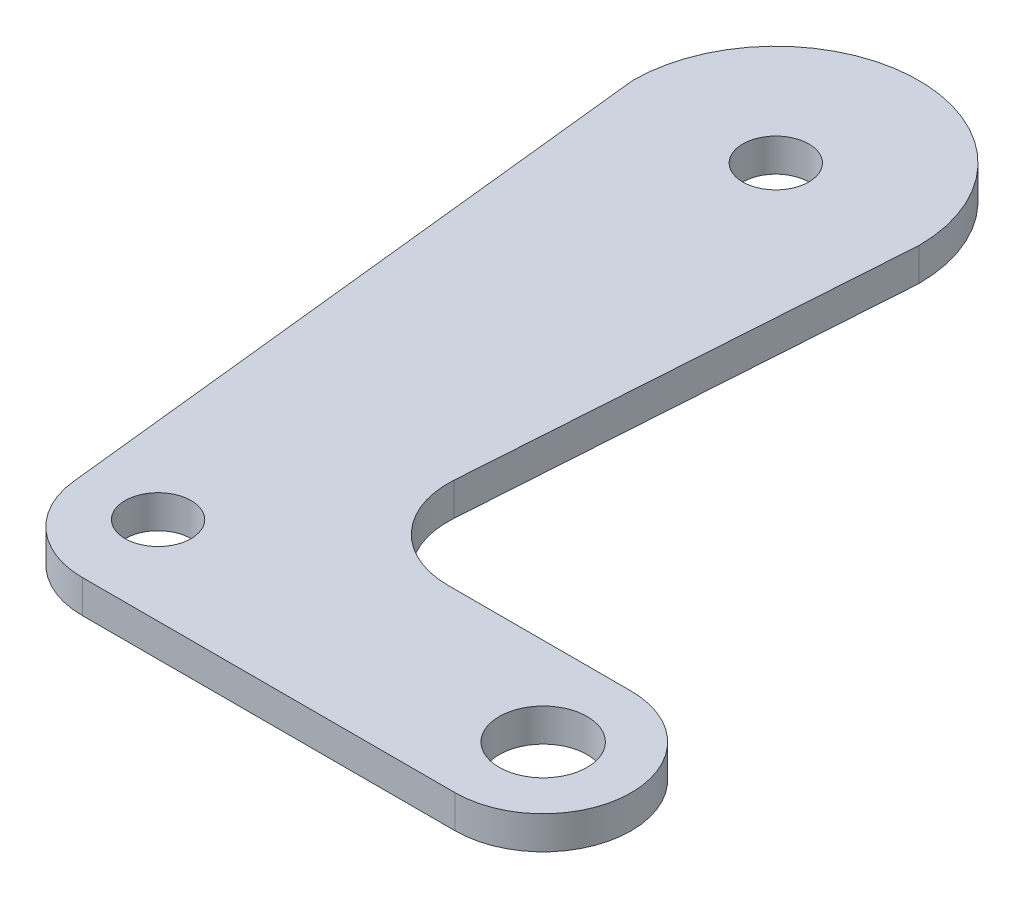
ISO-10303-21;
HEADER;
FILE_DESCRIPTION(('STEP AP214'),'2;1');
FILE_NAME('part.step','',(''),(''),'','','');
FILE_SCHEMA(('AUTOMOTIVE_DESIGN { 1 0 10303 214 1 1 1 1 }'));
ENDSEC;
DATA;
#1=APPLICATION_CONTEXT('core data for automotive mechanical design processes');
#2=APPLICATION_PROTOCOL_DEFINITION('international standard','automotive_design',2000,#1);
#3=PRODUCT_CONTEXT('',#1,'mechanical');
#4=PRODUCT('Part','Part','',(#3));
#5=PRODUCT_RELATED_PRODUCT_CATEGORY('part','',(#4));
#6=PRODUCT_DEFINITION_FORMATION('','',#4);
#7=PRODUCT_DEFINITION_CONTEXT('part definition',#1,'design');
#8=PRODUCT_DEFINITION('design','',#6,#7);
#9=PRODUCT_DEFINITION_SHAPE('','',#8);
#10=(LENGTH_UNIT() NAMED_UNIT(*) SI_UNIT(.MILLI.,.METRE.));
#11=(NAMED_UNIT(*) PLANE_ANGLE_UNIT() SI_UNIT($,.RADIAN.));
#12=(NAMED_UNIT(*) SI_UNIT($,.STERADIAN.) SOLID_ANGLE_UNIT());
#13=UNCERTAINTY_MEASURE_WITH_UNIT(LENGTH_MEASURE(1.E-05),#10,'distance_accuracy_value','');
#14=(GEOMETRIC_REPRESENTATION_CONTEXT(3) GLOBAL_UNCERTAINTY_ASSIGNED_CONTEXT((#13)) GLOBAL_UNIT_ASSIGNED_CONTEXT((#10,
#11,#12)) REPRESENTATION_CONTEXT('',''));
#15=CARTESIAN_POINT('',(0.,0.,0.));
#16=DIRECTION('',(0.,0.,1.));
#17=DIRECTION('',(1.,0.,0.));
#18=AXIS2_PLACEMENT_3D('',#15,#16,#17);
#19=CARTESIAN_POINT('',(35.,-3.,0.));
#20=DIRECTION('',(0.,1.,0.));
#21=DIRECTION('',(0.,0.,1.));
#22=AXIS2_PLACEMENT_3D('',#19,#20,#21);
#23=CYLINDRICAL_SURFACE('',#22,8.);
#24=CARTESIAN_POINT('',(35.,0.,0.));
#25=DIRECTION('',(0.,1.,0.));
#26=DIRECTION('',(0.,0.,1.));
#27=AXIS2_PLACEMENT_3D('',#24,#25,#26);
#28=CIRCLE('',#27,8.);
#29=CARTESIAN_POINT('',(35.,0.,8.));
#30=VERTEX_POINT('',#29);
#31=CARTESIAN_POINT('',(35.,0.,-8.));
#32=VERTEX_POINT('',#31);
#33=EDGE_CURVE('E136',#30,#32,#28,.T.);
#34=ORIENTED_EDGE('',*,*,#33,.F.);
#35=DIRECTION('',(0.,1.,0.));
#36=VECTOR('',#35,1.);
#37=CARTESIAN_POINT('',(35.,-3.,8.));
#38=LINE('',#37,#36);
#39=CARTESIAN_POINT('',(35.,-3.,8.));
#40=VERTEX_POINT('',#39);
#41=EDGE_CURVE('E11',#40,#30,#38,.T.);
#42=ORIENTED_EDGE('',*,*,#41,.F.);
#43=CARTESIAN_POINT('',(35.,-3.,0.));
#44=DIRECTION('',(0.,1.,0.));
#45=DIRECTION('',(0.,0.,1.));
#46=AXIS2_PLACEMENT_3D('',#43,#44,#45);
#47=CIRCLE('',#46,8.);
#48=CARTESIAN_POINT('',(35.,-3.,-8.));
#49=VERTEX_POINT('',#48);
#50=EDGE_CURVE('E157',#40,#49,#47,.T.);
#51=ORIENTED_EDGE('',*,*,#50,.T.);
#52=DIRECTION('',(0.,1.,0.));
#53=VECTOR('',#52,1.);
#54=CARTESIAN_POINT('',(35.,-3.,-8.));
#55=LINE('',#54,#53);
#56=EDGE_CURVE('E42',#49,#32,#55,.T.);
#57=ORIENTED_EDGE('',*,*,#56,.T.);
#58=EDGE_LOOP('',(#34,#42,#51,#57));
#59=FACE_BOUND('',#58,.T.);
#60=ADVANCED_FACE('F39',(#59),#23,.T.);
#61=CARTESIAN_POINT('',(35.,-3.,8.));
#62=DIRECTION('',(0.,0.,1.));
#63=DIRECTION('',(1.,0.,0.));
#64=AXIS2_PLACEMENT_3D('',#61,#62,#63);
#65=PLANE('',#64);
#66=DIRECTION('',(1.,0.,0.));
#67=VECTOR('',#66,1.);
#68=CARTESIAN_POINT('',(35.,0.,8.));
#69=LINE('',#68,#67);
#70=CARTESIAN_POINT('',(1.10862917569041,0.,8.));
#71=VERTEX_POINT('',#70);
#72=EDGE_CURVE('E155',#71,#30,#69,.T.);
#73=ORIENTED_EDGE('',*,*,#72,.F.);
#74=DIRECTION('',(0.,1.,0.));
#75=VECTOR('',#74,1.);
#76=CARTESIAN_POINT('',(1.10862917569041,-3.,8.));
#77=LINE('',#76,#75);
#78=CARTESIAN_POINT('',(1.10862917569041,-3.,8.));
#79=VERTEX_POINT('',#78);
#80=EDGE_CURVE('E48',#79,#71,#77,.T.);
#81=ORIENTED_EDGE('',*,*,#80,.F.);
#82=DIRECTION('',(1.,0.,0.));
#83=VECTOR('',#82,1.);
#84=CARTESIAN_POINT('',(35.,-3.,8.));
#85=LINE('',#84,#83);
#86=EDGE_CURVE('E126',#79,#40,#85,.T.);
#87=ORIENTED_EDGE('',*,*,#86,.T.);
#88=ORIENTED_EDGE('',*,*,#41,.T.);
#89=EDGE_LOOP('',(#73,#81,#87,#88));
#90=FACE_BOUND('',#89,.T.);
#91=ADVANCED_FACE('F169',(#90),#65,.T.);
#92=CARTESIAN_POINT('',(1.10862917569041,-3.,0.));
#93=DIRECTION('',(0.,1.,0.));
#94=DIRECTION('',(0.,0.,1.));
#95=AXIS2_PLACEMENT_3D('',#92,#93,#94);
#96=CYLINDRICAL_SURFACE('',#95,8.);
#97=CARTESIAN_POINT('',(1.10862917569041,0.,0.));
#98=DIRECTION('',(0.,1.,0.));
#99=DIRECTION('',(0.,0.,-1.));
#100=AXIS2_PLACEMENT_3D('',#97,#98,#99);
#101=CIRCLE('',#100,8.);
#102=CARTESIAN_POINT('',(-6.84513596427269,0.,0.858848122957551));
#103=VERTEX_POINT('',#102);
#104=EDGE_CURVE('E113',#103,#71,#101,.T.);
#105=ORIENTED_EDGE('',*,*,#104,.F.);
#106=DIRECTION('',(0.,1.,0.));
#107=VECTOR('',#106,1.);
#108=CARTESIAN_POINT('',(-6.84513596427269,-3.,0.858848122957551));
#109=LINE('',#108,#107);
#110=CARTESIAN_POINT('',(-6.84513596427269,-3.,0.858848122957551));
#111=VERTEX_POINT('',#110);
#112=EDGE_CURVE('E108',#111,#103,#109,.T.);
#113=ORIENTED_EDGE('',*,*,#112,.F.);
#114=CARTESIAN_POINT('',(1.10862917569041,-3.,0.));
#115=DIRECTION('',(0.,1.,0.));
#116=DIRECTION('',(0.,0.,-1.));
#117=AXIS2_PLACEMENT_3D('',#114,#115,#116);
#118=CIRCLE('',#117,8.);
#119=EDGE_CURVE('E111',#111,#79,#118,.T.);
#120=ORIENTED_EDGE('',*,*,#119,.T.);
#121=ORIENTED_EDGE('',*,*,#80,.T.);
#122=EDGE_LOOP('',(#105,#113,#120,#121));
#123=FACE_BOUND('',#122,.T.);
#124=ADVANCED_FACE('F110',(#123),#96,.T.);
#125=CARTESIAN_POINT('',(-6.84513596427269,-3.,0.858848122957552));
#126=DIRECTION('',(-0.994220642495388,0.,0.107356015369694));
#127=DIRECTION('',(0.107356015369694,0.,0.994220642495388));
#128=AXIS2_PLACEMENT_3D('',#125,#126,#127);
#129=PLANE('',#128);
#130=DIRECTION('',(0.107356015369694,0.,0.994220642495388));
#131=VECTOR('',#130,1.);
#132=CARTESIAN_POINT('',(-6.84513596427269,0.,0.858848122957552));
#133=LINE('',#132,#131);
#134=CARTESIAN_POINT('',(-13.,0.,-56.1411518770425));
#135=VERTEX_POINT('',#134);
#136=EDGE_CURVE('E152',#135,#103,#133,.T.);
#137=ORIENTED_EDGE('',*,*,#136,.F.);
#138=DIRECTION('',(0.,1.,0.));
#139=VECTOR('',#138,1.);
#140=CARTESIAN_POINT('',(-13.,-3.,-56.1411518770425));
#141=LINE('',#140,#139);
#142=CARTESIAN_POINT('',(-13.,-3.,-56.1411518770425));
#143=VERTEX_POINT('',#142);
#144=EDGE_CURVE('E118',#143,#135,#141,.T.);
#145=ORIENTED_EDGE('',*,*,#144,.F.);
#146=DIRECTION('',(0.107356015369694,0.,0.994220642495388));
#147=VECTOR('',#146,1.);
#148=CARTESIAN_POINT('',(-6.84513596427269,-3.,0.858848122957552));
#149=LINE('',#148,#147);
#150=EDGE_CURVE('E124',#143,#111,#149,.T.);
#151=ORIENTED_EDGE('',*,*,#150,.T.);
#152=ORIENTED_EDGE('',*,*,#112,.T.);
#153=EDGE_LOOP('',(#137,#145,#151,#152));
#154=FACE_BOUND('',#153,.T.);
#155=ADVANCED_FACE('F128',(#154),#129,.T.);
#156=CARTESIAN_POINT('',(0.,-3.,-56.1411518770425));
#157=DIRECTION('',(0.,1.,0.));
#158=DIRECTION('',(0.,0.,1.));
#159=AXIS2_PLACEMENT_3D('',#156,#157,#158);
#160=CYLINDRICAL_SURFACE('',#159,13.);
#161=CARTESIAN_POINT('',(0.,0.,-56.1411518770425));
#162=DIRECTION('',(0.,1.,0.));
#163=DIRECTION('',(0.,0.,1.));
#164=AXIS2_PLACEMENT_3D('',#161,#162,#163);
#165=CIRCLE('',#164,13.);
#166=CARTESIAN_POINT('',(13.,0.,-56.1411518770425));
#167=VERTEX_POINT('',#166);
#168=EDGE_CURVE('E149',#167,#135,#165,.T.);
#169=ORIENTED_EDGE('',*,*,#168,.F.);
#170=DIRECTION('',(0.,1.,0.));
#171=VECTOR('',#170,1.);
#172=CARTESIAN_POINT('',(13.,-3.,-56.1411518770425));
#173=LINE('',#172,#171);
#174=CARTESIAN_POINT('',(13.,-3.,-56.1411518770425));
#175=VERTEX_POINT('',#174);
#176=EDGE_CURVE('E161',#175,#167,#173,.T.);
#177=ORIENTED_EDGE('',*,*,#176,.F.);
#178=CARTESIAN_POINT('',(0.,-3.,-56.1411518770425));
#179=DIRECTION('',(0.,1.,0.));
#180=DIRECTION('',(0.,0.,1.));
#181=AXIS2_PLACEMENT_3D('',#178,#179,#180);
#182=CIRCLE('',#181,13.);
#183=EDGE_CURVE('E129',#175,#143,#182,.T.);
#184=ORIENTED_EDGE('',*,*,#183,.T.);
#185=ORIENTED_EDGE('',*,*,#144,.T.);
#186=EDGE_LOOP('',(#169,#177,#184,#185));
#187=FACE_BOUND('',#186,.T.);
#188=ADVANCED_FACE('F182',(#187),#160,.T.);
#189=CARTESIAN_POINT('',(13.,-3.,-56.1411518770425));
#190=DIRECTION('',(0.997758373364767,0.,0.0669195664995894));
#191=DIRECTION('',(0.0669195664995894,0.,-0.997758373364768));
#192=AXIS2_PLACEMENT_3D('',#189,#190,#191);
#193=PLANE('',#192);
#194=DIRECTION('',(0.0669195664995894,0.,-0.997758373364768));
#195=VECTOR('',#194,1.);
#196=CARTESIAN_POINT('',(13.,0.,-56.1411518770425));
#197=LINE('',#196,#195);
#198=CARTESIAN_POINT('',(10.343642783549,0.,-16.5353565319967));
#199=VERTEX_POINT('',#198);
#200=EDGE_CURVE('E146',#199,#167,#197,.T.);
#201=ORIENTED_EDGE('',*,*,#200,.F.);
#202=DIRECTION('',(0.,1.,0.));
#203=VECTOR('',#202,1.);
#204=CARTESIAN_POINT('',(10.343642783549,-3.,-16.5353565319967));
#205=LINE('',#204,#203);
#206=CARTESIAN_POINT('',(10.343642783549,-3.,-16.5353565319967));
#207=VERTEX_POINT('',#206);
#208=EDGE_CURVE('E163',#207,#199,#205,.T.);
#209=ORIENTED_EDGE('',*,*,#208,.F.);
#210=DIRECTION('',(0.0669195664995894,0.,-0.997758373364768));
#211=VECTOR('',#210,1.);
#212=CARTESIAN_POINT('',(13.,-3.,-56.1411518770425));
#213=LINE('',#212,#211);
#214=EDGE_CURVE('E131',#207,#175,#213,.T.);
#215=ORIENTED_EDGE('',*,*,#214,.T.);
#216=ORIENTED_EDGE('',*,*,#176,.T.);
#217=EDGE_LOOP('',(#201,#209,#215,#216));
#218=FACE_BOUND('',#217,.T.);
#219=ADVANCED_FACE('F185',(#218),#193,.T.);
#220=CARTESIAN_POINT('',(18.3257097704671,-3.,-16.));
#221=DIRECTION('',(0.,1.,0.));
#222=DIRECTION('',(0.,0.,1.));
#223=AXIS2_PLACEMENT_3D('',#220,#221,#222);
#224=CYLINDRICAL_SURFACE('',#223,8.);
#225=CARTESIAN_POINT('',(18.3257097704671,0.,-16.));
#226=DIRECTION('',(0.,-1.,0.));
#227=DIRECTION('',(0.,0.,1.));
#228=AXIS2_PLACEMENT_3D('',#225,#226,#227);
#229=CIRCLE('',#228,8.);
#230=CARTESIAN_POINT('',(18.3257097704671,0.,-8.));
#231=VERTEX_POINT('',#230);
#232=EDGE_CURVE('E143',#231,#199,#229,.T.);
#233=ORIENTED_EDGE('',*,*,#232,.F.);
#234=DIRECTION('',(0.,1.,0.));
#235=VECTOR('',#234,1.);
#236=CARTESIAN_POINT('',(18.3257097704671,-3.,-8.));
#237=LINE('',#236,#235);
#238=CARTESIAN_POINT('',(18.3257097704671,-3.,-8.));
#239=VERTEX_POINT('',#238);
#240=EDGE_CURVE('E164',#239,#231,#237,.T.);
#241=ORIENTED_EDGE('',*,*,#240,.F.);
#242=CARTESIAN_POINT('',(18.3257097704671,-3.,-16.));
#243=DIRECTION('',(0.,-1.,0.));
#244=DIRECTION('',(0.,0.,1.));
#245=AXIS2_PLACEMENT_3D('',#242,#243,#244);
#246=CIRCLE('',#245,8.);
#247=EDGE_CURVE('E241',#239,#207,#246,.T.);
#248=ORIENTED_EDGE('',*,*,#247,.T.);
#249=ORIENTED_EDGE('',*,*,#208,.T.);
#250=EDGE_LOOP('',(#233,#241,#248,#249));
#251=FACE_BOUND('',#250,.T.);
#252=ADVANCED_FACE('F189',(#251),#224,.F.);
#253=CARTESIAN_POINT('',(18.3257097704671,-3.,-8.));
#254=DIRECTION('',(0.,0.,-1.));
#255=DIRECTION('',(-1.,0.,0.));
#256=AXIS2_PLACEMENT_3D('',#253,#254,#255);
#257=PLANE('',#256);
#258=DIRECTION('',(-1.,0.,0.));
#259=VECTOR('',#258,1.);
#260=CARTESIAN_POINT('',(18.3257097704671,0.,-8.));
#261=LINE('',#260,#259);
#262=EDGE_CURVE('E139',#32,#231,#261,.T.);
#263=ORIENTED_EDGE('',*,*,#262,.F.);
#264=ORIENTED_EDGE('',*,*,#56,.F.);
#265=DIRECTION('',(-1.,0.,0.));
#266=VECTOR('',#265,1.);
#267=CARTESIAN_POINT('',(18.3257097704671,-3.,-8.));
#268=LINE('',#267,#266);
#269=EDGE_CURVE('E239',#49,#239,#268,.T.);
#270=ORIENTED_EDGE('',*,*,#269,.T.);
#271=ORIENTED_EDGE('',*,*,#240,.T.);
#272=EDGE_LOOP('',(#263,#264,#270,#271));
#273=FACE_BOUND('',#272,.T.);
#274=ADVANCED_FACE('F166',(#273),#257,.T.);
#275=CARTESIAN_POINT('',(35.,-3.,0.));
#276=DIRECTION('',(0.,1.,0.));
#277=DIRECTION('',(0.,0.,1.));
#278=AXIS2_PLACEMENT_3D('',#275,#276,#277);
#279=PLANE('',#278);
#280=CARTESIAN_POINT('',(0.,-3.,-56.1411518770425));
#281=DIRECTION('',(0.,1.,0.));
#282=DIRECTION('',(0.,0.,1.));
#283=AXIS2_PLACEMENT_3D('',#280,#281,#282);
#284=CIRCLE('',#283,3.);
#285=CARTESIAN_POINT('',(0.,-3.,-53.1411518770425));
#286=VERTEX_POINT('',#285);
#287=EDGE_CURVE('E220',#286,#286,#284,.T.);
#288=ORIENTED_EDGE('',*,*,#287,.T.);
#289=EDGE_LOOP('',(#288));
#290=FACE_BOUND('',#289,.T.);
#291=CARTESIAN_POINT('',(35.,-3.,0.));
#292=DIRECTION('',(0.,1.,0.));
#293=DIRECTION('',(0.,0.,1.));
#294=AXIS2_PLACEMENT_3D('',#291,#292,#293);
#295=CIRCLE('',#294,4.00000000000001);
#296=CARTESIAN_POINT('',(35.,-3.,4.00000000000001));
#297=VERTEX_POINT('',#296);
#298=EDGE_CURVE('E228',#297,#297,#295,.T.);
#299=ORIENTED_EDGE('',*,*,#298,.T.);
#300=EDGE_LOOP('',(#299));
#301=FACE_BOUND('',#300,.T.);
#302=CARTESIAN_POINT('',(0.,-3.,0.));
#303=DIRECTION('',(0.,1.,0.));
#304=DIRECTION('',(0.,0.,1.));
#305=AXIS2_PLACEMENT_3D('',#302,#303,#304);
#306=CIRCLE('',#305,3.);
#307=CARTESIAN_POINT('',(0.,-3.,3.));
#308=VERTEX_POINT('',#307);
#309=EDGE_CURVE('E140',#308,#308,#306,.T.);
#310=ORIENTED_EDGE('',*,*,#309,.T.);
#311=EDGE_LOOP('',(#310));
#312=FACE_BOUND('',#311,.T.);
#313=ORIENTED_EDGE('',*,*,#50,.F.);
#314=ORIENTED_EDGE('',*,*,#86,.F.);
#315=ORIENTED_EDGE('',*,*,#119,.F.);
#316=ORIENTED_EDGE('',*,*,#150,.F.);
#317=ORIENTED_EDGE('',*,*,#183,.F.);
#318=ORIENTED_EDGE('',*,*,#214,.F.);
#319=ORIENTED_EDGE('',*,*,#247,.F.);
#320=ORIENTED_EDGE('',*,*,#269,.F.);
#321=EDGE_LOOP('',(#313,#314,#315,#316,#317,#318,#319,#320));
#322=FACE_BOUND('',#321,.T.);
#323=ADVANCED_FACE('F122',(#290,#301,#312,#322),#279,.F.);
#324=CARTESIAN_POINT('',(35.,0.,0.));
#325=DIRECTION('',(0.,1.,0.));
#326=DIRECTION('',(0.,0.,1.));
#327=AXIS2_PLACEMENT_3D('',#324,#325,#326);
#328=PLANE('',#327);
#329=CARTESIAN_POINT('',(0.,0.,-56.1411518770425));
#330=DIRECTION('',(0.,1.,0.));
#331=DIRECTION('',(0.,0.,1.));
#332=AXIS2_PLACEMENT_3D('',#329,#330,#331);
#333=CIRCLE('',#332,3.);
#334=CARTESIAN_POINT('',(0.,0.,-53.1411518770425));
#335=VERTEX_POINT('',#334);
#336=EDGE_CURVE('E223',#335,#335,#333,.T.);
#337=ORIENTED_EDGE('',*,*,#336,.F.);
#338=EDGE_LOOP('',(#337));
#339=FACE_BOUND('',#338,.T.);
#340=CARTESIAN_POINT('',(35.,0.,0.));
#341=DIRECTION('',(0.,1.,0.));
#342=DIRECTION('',(0.,0.,1.));
#343=AXIS2_PLACEMENT_3D('',#340,#341,#342);
#344=CIRCLE('',#343,4.00000000000001);
#345=CARTESIAN_POINT('',(35.,0.,4.00000000000001));
#346=VERTEX_POINT('',#345);
#347=EDGE_CURVE('E225',#346,#346,#344,.T.);
#348=ORIENTED_EDGE('',*,*,#347,.F.);
#349=EDGE_LOOP('',(#348));
#350=FACE_BOUND('',#349,.T.);
#351=CARTESIAN_POINT('',(0.,0.,0.));
#352=DIRECTION('',(0.,1.,0.));
#353=DIRECTION('',(0.,0.,1.));
#354=AXIS2_PLACEMENT_3D('',#351,#352,#353);
#355=CIRCLE('',#354,3.);
#356=CARTESIAN_POINT('',(0.,0.,3.));
#357=VERTEX_POINT('',#356);
#358=EDGE_CURVE('E231',#357,#357,#355,.T.);
#359=ORIENTED_EDGE('',*,*,#358,.F.);
#360=EDGE_LOOP('',(#359));
#361=FACE_BOUND('',#360,.T.);
#362=ORIENTED_EDGE('',*,*,#33,.T.);
#363=ORIENTED_EDGE('',*,*,#262,.T.);
#364=ORIENTED_EDGE('',*,*,#232,.T.);
#365=ORIENTED_EDGE('',*,*,#200,.T.);
#366=ORIENTED_EDGE('',*,*,#168,.T.);
#367=ORIENTED_EDGE('',*,*,#136,.T.);
#368=ORIENTED_EDGE('',*,*,#104,.T.);
#369=ORIENTED_EDGE('',*,*,#72,.T.);
#370=EDGE_LOOP('',(#362,#363,#364,#365,#366,#367,#368,#369));
#371=FACE_BOUND('',#370,.T.);
#372=ADVANCED_FACE('F168',(#339,#350,#361,#371),#328,.T.);
#373=CARTESIAN_POINT('',(0.,-3.,0.));
#374=DIRECTION('',(0.,1.,0.));
#375=DIRECTION('',(0.,0.,1.));
#376=AXIS2_PLACEMENT_3D('',#373,#374,#375);
#377=CYLINDRICAL_SURFACE('',#376,3.);
#378=ORIENTED_EDGE('',*,*,#309,.F.);
#379=EDGE_LOOP('',(#378));
#380=FACE_BOUND('',#379,.T.);
#381=ORIENTED_EDGE('',*,*,#358,.T.);
#382=EDGE_LOOP('',(#381));
#383=FACE_BOUND('',#382,.T.);
#384=ADVANCED_FACE('F201',(#380,#383),#377,.F.);
#385=CARTESIAN_POINT('',(35.,-3.,0.));
#386=DIRECTION('',(0.,1.,0.));
#387=DIRECTION('',(0.,0.,1.));
#388=AXIS2_PLACEMENT_3D('',#385,#386,#387);
#389=CYLINDRICAL_SURFACE('',#388,4.00000000000001);
#390=ORIENTED_EDGE('',*,*,#298,.F.);
#391=EDGE_LOOP('',(#390));
#392=FACE_BOUND('',#391,.T.);
#393=ORIENTED_EDGE('',*,*,#347,.T.);
#394=EDGE_LOOP('',(#393));
#395=FACE_BOUND('',#394,.T.);
#396=ADVANCED_FACE('F208',(#392,#395),#389,.F.);
#397=CARTESIAN_POINT('',(0.,-3.,-56.1411518770425));
#398=DIRECTION('',(0.,1.,0.));
#399=DIRECTION('',(0.,0.,1.));
#400=AXIS2_PLACEMENT_3D('',#397,#398,#399);
#401=CYLINDRICAL_SURFACE('',#400,3.);
#402=ORIENTED_EDGE('',*,*,#287,.F.);
#403=EDGE_LOOP('',(#402));
#404=FACE_BOUND('',#403,.T.);
#405=ORIENTED_EDGE('',*,*,#336,.T.);
#406=EDGE_LOOP('',(#405));
#407=FACE_BOUND('',#406,.T.);
#408=ADVANCED_FACE('F212',(#404,#407),#401,.F.);
#409=CLOSED_SHELL('',(#60,#91,#124,#155,#188,#219,#252,#274,#323,#372,#384,#396,#408));
#410=MANIFOLD_SOLID_BREP('B2',#409);
#411=ADVANCED_BREP_SHAPE_REPRESENTATION('',(#18,#410),#14);
#412=SHAPE_DEFINITION_REPRESENTATION(#9,#411);
ENDSEC;
END-ISO-10303-21;
